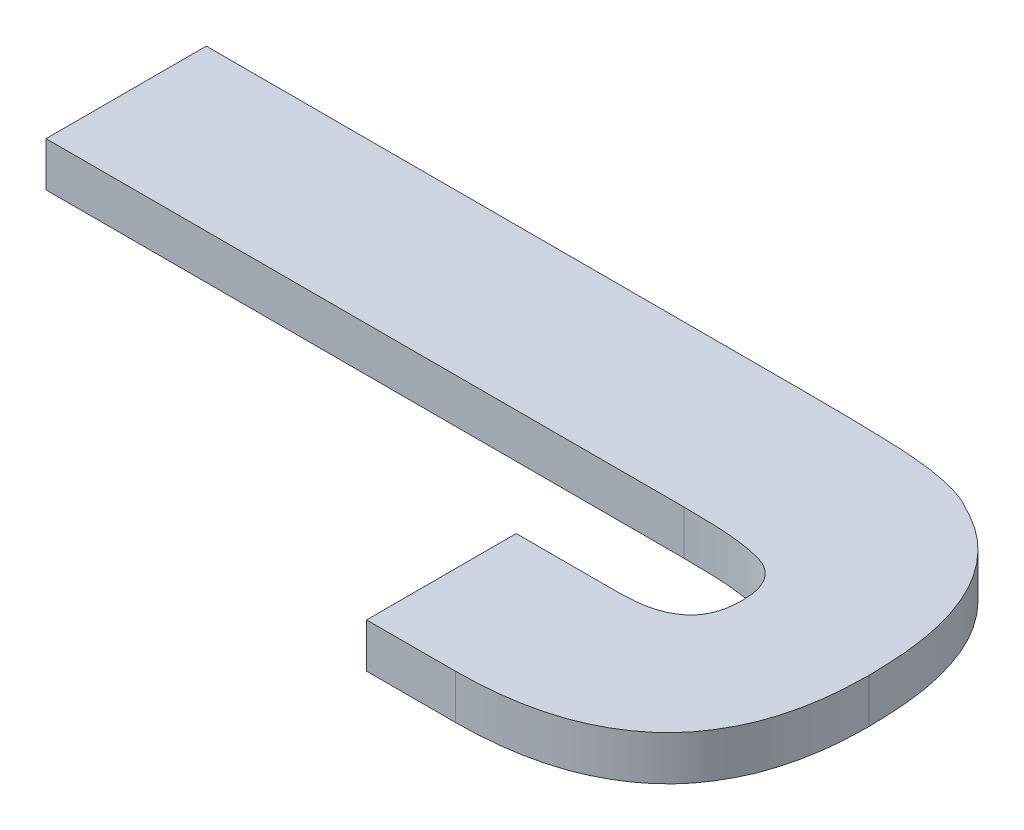
ISO-10303-21;
HEADER;
FILE_DESCRIPTION(('STEP AP214'),'2;1');
FILE_NAME('part.step','',(''),(''),'','','');
FILE_SCHEMA(('AUTOMOTIVE_DESIGN { 1 0 10303 214 1 1 1 1 }'));
ENDSEC;
DATA;
#1=APPLICATION_CONTEXT('core data for automotive mechanical design processes');
#2=APPLICATION_PROTOCOL_DEFINITION('international standard','automotive_design',2000,#1);
#3=PRODUCT_CONTEXT('',#1,'mechanical');
#4=PRODUCT('Part','Part','',(#3));
#5=PRODUCT_RELATED_PRODUCT_CATEGORY('part','',(#4));
#6=PRODUCT_DEFINITION_FORMATION('','',#4);
#7=PRODUCT_DEFINITION_CONTEXT('part definition',#1,'design');
#8=PRODUCT_DEFINITION('design','',#6,#7);
#9=PRODUCT_DEFINITION_SHAPE('','',#8);
#10=(LENGTH_UNIT() NAMED_UNIT(*) SI_UNIT(.MILLI.,.METRE.));
#11=(NAMED_UNIT(*) PLANE_ANGLE_UNIT() SI_UNIT($,.RADIAN.));
#12=(NAMED_UNIT(*) SI_UNIT($,.STERADIAN.) SOLID_ANGLE_UNIT());
#13=UNCERTAINTY_MEASURE_WITH_UNIT(LENGTH_MEASURE(1.E-05),#10,'distance_accuracy_value','');
#14=(GEOMETRIC_REPRESENTATION_CONTEXT(3) GLOBAL_UNCERTAINTY_ASSIGNED_CONTEXT((#13)) GLOBAL_UNIT_ASSIGNED_CONTEXT((#10,
#11,#12)) REPRESENTATION_CONTEXT('',''));
#15=CARTESIAN_POINT('',(0.,0.,0.));
#16=DIRECTION('',(0.,0.,1.));
#17=DIRECTION('',(1.,0.,0.));
#18=AXIS2_PLACEMENT_3D('',#15,#16,#17);
#19=CARTESIAN_POINT('',(2.0840978836,2.9906,4.3741557850555));
#20=DIRECTION('',(0.,0.,1.));
#21=DIRECTION('',(0.,-1.,0.));
#22=AXIS2_PLACEMENT_3D('',#19,#20,#21);
#23=PLANE('',#22);
#24=DIRECTION('',(-1.,0.,0.));
#25=VECTOR('',#24,1.);
#26=CARTESIAN_POINT('',(2.0840978836,2.9306,4.3741557850555));
#27=LINE('',#26,#25);
#28=CARTESIAN_POINT('',(2.0840978836,2.9306,4.3741557850555));
#29=VERTEX_POINT('',#28);
#30=CARTESIAN_POINT('',(1.9642541336,2.9306,4.3741557850555));
#31=VERTEX_POINT('',#30);
#32=EDGE_CURVE('E11',#29,#31,#27,.T.);
#33=ORIENTED_EDGE('',*,*,#32,.F.);
#34=DIRECTION('',(0.,-1.,0.));
#35=VECTOR('',#34,1.);
#36=CARTESIAN_POINT('',(2.0840978836,2.9906,4.3741557850555));
#37=LINE('',#36,#35);
#38=CARTESIAN_POINT('',(2.0840978836,2.9906,4.3741557850555));
#39=VERTEX_POINT('',#38);
#40=EDGE_CURVE('E24',#39,#29,#37,.T.);
#41=ORIENTED_EDGE('',*,*,#40,.F.);
#42=DIRECTION('',(-1.,0.,0.));
#43=VECTOR('',#42,1.);
#44=CARTESIAN_POINT('',(2.0840978836,2.9906,4.3741557850555));
#45=LINE('',#44,#43);
#46=CARTESIAN_POINT('',(1.9642541336,2.9906,4.3741557850555));
#47=VERTEX_POINT('',#46);
#48=EDGE_CURVE('E244',#39,#47,#45,.T.);
#49=ORIENTED_EDGE('',*,*,#48,.T.);
#50=DIRECTION('',(0.,-1.,0.));
#51=VECTOR('',#50,1.);
#52=CARTESIAN_POINT('',(1.9642541336,2.9906,4.3741557850555));
#53=LINE('',#52,#51);
#54=EDGE_CURVE('E120',#47,#31,#53,.T.);
#55=ORIENTED_EDGE('',*,*,#54,.T.);
#56=EDGE_LOOP('',(#33,#41,#49,#55));
#57=FACE_BOUND('',#56,.T.);
#58=ADVANCED_FACE('F17',(#57),#23,.T.);
#59=CARTESIAN_POINT('',(2.3686985780444,2.9906,4.099711340611));
#60=CARTESIAN_POINT('',(2.3686985780444,2.9306,4.099711340611));
#61=CARTESIAN_POINT('',(2.3684961906251,2.9906,4.1107792519947));
#62=CARTESIAN_POINT('',(2.3684961906251,2.9306,4.1107792519947));
#63=CARTESIAN_POINT('',(2.3681041661007,2.9906,4.1322178014375));
#64=CARTESIAN_POINT('',(2.3681041661007,2.9306,4.1322178014375));
#65=CARTESIAN_POINT('',(2.3646813892459,2.9906,4.1633243721228));
#66=CARTESIAN_POINT('',(2.3646813892459,2.9306,4.1633243721228));
#67=CARTESIAN_POINT('',(2.3590525967969,2.9906,4.1922251989204));
#68=CARTESIAN_POINT('',(2.3590525967969,2.9306,4.1922251989204));
#69=CARTESIAN_POINT('',(2.3514966605484,2.9906,4.2191540828439));
#70=CARTESIAN_POINT('',(2.3514966605484,2.9306,4.2191540828439));
#71=CARTESIAN_POINT('',(2.3412777970055,2.9906,4.2438895573409));
#72=CARTESIAN_POINT('',(2.3412777970055,2.9306,4.2438895573409));
#73=CARTESIAN_POINT('',(2.3287792206801,2.9906,4.2665361280315));
#74=CARTESIAN_POINT('',(2.3287792206801,2.9306,4.2665361280315));
#75=CARTESIAN_POINT('',(2.3143745762558,2.9906,4.2873711796985));
#76=CARTESIAN_POINT('',(2.3143745762558,2.9306,4.2873711796985));
#77=CARTESIAN_POINT('',(2.2972805098538,2.9906,4.3056514824483));
#78=CARTESIAN_POINT('',(2.2972805098538,2.9306,4.3056514824483));
#79=CARTESIAN_POINT('',(2.2781177542668,2.9906,4.3218700809515));
#80=CARTESIAN_POINT('',(2.2781177542668,2.9306,4.3218700809515));
#81=CARTESIAN_POINT('',(2.2567230719195,2.9906,4.3359046646467));
#82=CARTESIAN_POINT('',(2.2567230719195,2.9306,4.3359046646467));
#83=CARTESIAN_POINT('',(2.2331909255557,2.9906,4.3478704630677));
#84=CARTESIAN_POINT('',(2.2331909255557,2.9306,4.3478704630677));
#85=CARTESIAN_POINT('',(2.2075281212777,2.9906,4.3575799157711));
#86=CARTESIAN_POINT('',(2.2075281212777,2.9306,4.3575799157711));
#87=CARTESIAN_POINT('',(2.179686874294,2.9906,4.364993925283));
#88=CARTESIAN_POINT('',(2.179686874294,2.9306,4.364993925283));
#89=CARTESIAN_POINT('',(2.1497226885865,2.9906,4.370360844908));
#90=CARTESIAN_POINT('',(2.1497226885865,2.9306,4.370360844908));
#91=CARTESIAN_POINT('',(2.1175669153872,2.9906,4.3734906674268));
#92=CARTESIAN_POINT('',(2.1175669153872,2.9306,4.3734906674268));
#93=CARTESIAN_POINT('',(2.0954647450341,2.9906,4.3739298956431));
#94=CARTESIAN_POINT('',(2.0954647450341,2.9306,4.3739298956431));
#95=CARTESIAN_POINT('',(2.0840978836,2.9906,4.3741557850555));
#96=CARTESIAN_POINT('',(2.0840978836,2.9306,4.3741557850555));
#97=B_SPLINE_SURFACE_WITH_KNOTS('',3,1,((#59,#60),(#61,#62),(#63,#64),(#65,#66),(#67,#68),(#69,
#70),(#71,#72),(#73,#74),(#75,#76),(#77,#78),(#79,#80),(#81,#82),(#83,#84),(#85,#86),(#87,#88),
(#89,#90),(#91,#92),(#93,#94),(#95,#96)),.UNSPECIFIED.,.F.,.F.,.F.,(4,1,1,1,1,1,1,1,1,1,1,1,1,1,
1,1,4),(2,2),(0.,0.0732734976880392,0.141930798735896,0.206901551831919,0.268077284735017,
0.326823463536979,0.38367829497039,0.439100806924737,0.494094020293022,0.548886045195723,
0.604982851534821,0.663132456099408,0.723363791074527,0.786324811204568,0.853651669388618,
0.924734939211817,1.),(0.,1.),.UNSPECIFIED.);
#98=CARTESIAN_POINT('',(2.3686985780444,2.9306,4.099711340611));
#99=CARTESIAN_POINT('',(2.3684961906251,2.9306,4.1107792519947));
#100=CARTESIAN_POINT('',(2.3681041661007,2.9306,4.1322178014375));
#101=CARTESIAN_POINT('',(2.3646813892459,2.9306,4.1633243721228));
#102=CARTESIAN_POINT('',(2.3590525967969,2.9306,4.1922251989204));
#103=CARTESIAN_POINT('',(2.3514966605484,2.9306,4.2191540828439));
#104=CARTESIAN_POINT('',(2.3412777970055,2.9306,4.2438895573409));
#105=CARTESIAN_POINT('',(2.3287792206801,2.9306,4.2665361280315));
#106=CARTESIAN_POINT('',(2.3143745762558,2.9306,4.2873711796985));
#107=CARTESIAN_POINT('',(2.2972805098538,2.9306,4.3056514824483));
#108=CARTESIAN_POINT('',(2.2781177542668,2.9306,4.3218700809515));
#109=CARTESIAN_POINT('',(2.2567230719195,2.9306,4.3359046646467));
#110=CARTESIAN_POINT('',(2.2331909255557,2.9306,4.3478704630677));
#111=CARTESIAN_POINT('',(2.2075281212777,2.9306,4.3575799157711));
#112=CARTESIAN_POINT('',(2.179686874294,2.9306,4.364993925283));
#113=CARTESIAN_POINT('',(2.1497226885865,2.9306,4.370360844908));
#114=CARTESIAN_POINT('',(2.1175669153872,2.9306,4.3734906674268));
#115=CARTESIAN_POINT('',(2.0954647450341,2.9306,4.3739298956431));
#116=CARTESIAN_POINT('',(2.0840978836,2.9306,4.3741557850555));
#117=B_SPLINE_CURVE_WITH_KNOTS('',3,(#98,#99,#100,#101,#102,#103,#104,#105,#106,#107,#108,#109,
#110,#111,#112,#113,#114,#115,#116),.UNSPECIFIED.,.F.,.F.,(4,1,1,1,1,1,1,1,1,1,1,1,1,1,1,1,4),
(0.,0.0732734976880392,0.141930798735896,0.206901551831919,0.268077284735017,0.326823463536979,
0.38367829497039,0.439100806924737,0.494094020293022,0.548886045195723,0.604982851534821,
0.663132456099408,0.723363791074527,0.786324811204568,0.853651669388618,0.924734939211817,1.),.UNSPECIFIED.);
#118=CARTESIAN_POINT('',(2.3686985780444,2.9306,4.099711340611));
#119=VERTEX_POINT('',#118);
#120=EDGE_CURVE('E236',#119,#29,#117,.T.);
#121=DIRECTION('',(0.,-1.,0.));
#122=VECTOR('',#121,1.);
#123=CARTESIAN_POINT('',(2.3686985780444,2.9906,4.099711340611));
#124=LINE('',#123,#122);
#125=CARTESIAN_POINT('',(2.3686985780444,2.9906,4.099711340611));
#126=VERTEX_POINT('',#125);
#127=EDGE_CURVE('E230',#126,#119,#124,.T.);
#128=CARTESIAN_POINT('',(2.3686985780444,2.9906,4.099711340611));
#129=CARTESIAN_POINT('',(2.3684961906251,2.9906,4.1107792519947));
#130=CARTESIAN_POINT('',(2.3681041661007,2.9906,4.1322178014375));
#131=CARTESIAN_POINT('',(2.3646813892459,2.9906,4.1633243721228));
#132=CARTESIAN_POINT('',(2.3590525967969,2.9906,4.1922251989204));
#133=CARTESIAN_POINT('',(2.3514966605484,2.9906,4.2191540828439));
#134=CARTESIAN_POINT('',(2.3412777970055,2.9906,4.2438895573409));
#135=CARTESIAN_POINT('',(2.3287792206801,2.9906,4.2665361280315));
#136=CARTESIAN_POINT('',(2.3143745762558,2.9906,4.2873711796985));
#137=CARTESIAN_POINT('',(2.2972805098538,2.9906,4.3056514824483));
#138=CARTESIAN_POINT('',(2.2781177542668,2.9906,4.3218700809515));
#139=CARTESIAN_POINT('',(2.2567230719195,2.9906,4.3359046646467));
#140=CARTESIAN_POINT('',(2.2331909255557,2.9906,4.3478704630677));
#141=CARTESIAN_POINT('',(2.2075281212777,2.9906,4.3575799157711));
#142=CARTESIAN_POINT('',(2.179686874294,2.9906,4.364993925283));
#143=CARTESIAN_POINT('',(2.1497226885865,2.9906,4.370360844908));
#144=CARTESIAN_POINT('',(2.1175669153872,2.9906,4.3734906674268));
#145=CARTESIAN_POINT('',(2.0954647450341,2.9906,4.3739298956431));
#146=CARTESIAN_POINT('',(2.0840978836,2.9906,4.3741557850555));
#147=B_SPLINE_CURVE_WITH_KNOTS('',3,(#128,#129,#130,#131,#132,#133,#134,#135,#136,#137,#138,
#139,#140,#141,#142,#143,#144,#145,#146),.UNSPECIFIED.,.F.,.F.,(4,1,1,1,1,1,1,1,1,1,1,1,1,1,1,1,
4),(0.,0.0732734976880392,0.141930798735896,0.206901551831919,0.268077284735017,
0.326823463536979,0.38367829497039,0.439100806924737,0.494094020293022,0.548886045195723,
0.604982851534821,0.663132456099408,0.723363791074527,0.786324811204568,0.853651669388618,
0.924734939211817,1.),.UNSPECIFIED.);
#148=EDGE_CURVE('E222',#126,#39,#147,.T.);
#149=ORIENTED_EDGE('',*,*,#120,.F.);
#150=ORIENTED_EDGE('',*,*,#127,.F.);
#151=ORIENTED_EDGE('',*,*,#148,.T.);
#152=ORIENTED_EDGE('',*,*,#40,.T.);
#153=EDGE_LOOP('',(#149,#150,#151,#152));
#154=FACE_BOUND('',#153,.T.);
#155=ADVANCED_FACE('F246',(#154),#97,.T.);
#156=CARTESIAN_POINT('',(2.2280909391555,2.9906,3.8329405072777));
#157=CARTESIAN_POINT('',(2.2280909391555,2.9306,3.8329405072777));
#158=CARTESIAN_POINT('',(2.2393451820832,2.9906,3.8387810913324));
#159=CARTESIAN_POINT('',(2.2393451820832,2.9306,3.8387810913324));
#160=CARTESIAN_POINT('',(2.2614186535248,2.9906,3.8502365011866));
#161=CARTESIAN_POINT('',(2.2614186535248,2.9306,3.8502365011866));
#162=CARTESIAN_POINT('',(2.29084693265,2.9906,3.8728717678507));
#163=CARTESIAN_POINT('',(2.29084693265,2.9306,3.8728717678507));
#164=CARTESIAN_POINT('',(2.3151261852842,2.9906,3.900161132454));
#165=CARTESIAN_POINT('',(2.3151261852842,2.9306,3.900161132454));
#166=CARTESIAN_POINT('',(2.3351498875105,2.9906,3.9313419982357));
#167=CARTESIAN_POINT('',(2.3351498875105,2.9306,3.9313419982357));
#168=CARTESIAN_POINT('',(2.3502125356949,2.9906,3.9670374247872));
#169=CARTESIAN_POINT('',(2.3502125356949,2.9306,3.9670374247872));
#170=CARTESIAN_POINT('',(2.3613325365982,2.9906,4.007048245364));
#171=CARTESIAN_POINT('',(2.3613325365982,2.9306,4.007048245364));
#172=CARTESIAN_POINT('',(2.3674033447803,2.9906,4.0519059229754));
#173=CARTESIAN_POINT('',(2.3674033447803,2.9306,4.0519059229754));
#174=CARTESIAN_POINT('',(2.3682537547865,2.9906,4.0832934781228));
#175=CARTESIAN_POINT('',(2.3682537547865,2.9306,4.0832934781228));
#176=CARTESIAN_POINT('',(2.3686985780444,2.9906,4.099711340611));
#177=CARTESIAN_POINT('',(2.3686985780444,2.9306,4.099711340611));
#178=B_SPLINE_SURFACE_WITH_KNOTS('',3,1,((#156,#157),(#158,#159),(#160,#161),(#162,#163),(#164,
#165),(#166,#167),(#168,#169),(#170,#171),(#172,#173),(#174,#175),(#176,#177)),.UNSPECIFIED.,
.F.,.F.,.F.,(4,1,1,1,1,1,1,1,4),(2,2),(0.,0.118506089621052,0.23243151953542,0.345099154038738,
0.458763236799667,0.577647250652674,0.706270073409169,0.846358930448891,1.),(0.,1.),.UNSPECIFIED.);
#179=CARTESIAN_POINT('',(2.2280909391555,2.9306,3.8329405072777));
#180=CARTESIAN_POINT('',(2.2393451820832,2.9306,3.8387810913324));
#181=CARTESIAN_POINT('',(2.2614186535248,2.9306,3.8502365011866));
#182=CARTESIAN_POINT('',(2.29084693265,2.9306,3.8728717678507));
#183=CARTESIAN_POINT('',(2.3151261852842,2.9306,3.900161132454));
#184=CARTESIAN_POINT('',(2.3351498875105,2.9306,3.9313419982357));
#185=CARTESIAN_POINT('',(2.3502125356949,2.9306,3.9670374247872));
#186=CARTESIAN_POINT('',(2.3613325365982,2.9306,4.007048245364));
#187=CARTESIAN_POINT('',(2.3674033447803,2.9306,4.0519059229754));
#188=CARTESIAN_POINT('',(2.3682537547865,2.9306,4.0832934781228));
#189=CARTESIAN_POINT('',(2.3686985780444,2.9306,4.099711340611));
#190=B_SPLINE_CURVE_WITH_KNOTS('',3,(#179,#180,#181,#182,#183,#184,#185,#186,#187,#188,#189),
.UNSPECIFIED.,.F.,.F.,(4,1,1,1,1,1,1,1,4),(0.,0.118506089621052,0.23243151953542,
0.345099154038738,0.458763236799667,0.577647250652674,0.706270073409169,0.846358930448891,1.),.UNSPECIFIED.);
#191=CARTESIAN_POINT('',(2.2280909391555,2.9306,3.8329405072777));
#192=VERTEX_POINT('',#191);
#193=EDGE_CURVE('E217',#192,#119,#190,.T.);
#194=DIRECTION('',(0.,-1.,0.));
#195=VECTOR('',#194,1.);
#196=CARTESIAN_POINT('',(2.2280909391555,2.9906,3.8329405072777));
#197=LINE('',#196,#195);
#198=CARTESIAN_POINT('',(2.2280909391555,2.9906,3.8329405072777));
#199=VERTEX_POINT('',#198);
#200=EDGE_CURVE('E211',#199,#192,#197,.T.);
#201=CARTESIAN_POINT('',(2.2280909391555,2.9906,3.8329405072777));
#202=CARTESIAN_POINT('',(2.2393451820832,2.9906,3.8387810913324));
#203=CARTESIAN_POINT('',(2.2614186535248,2.9906,3.8502365011866));
#204=CARTESIAN_POINT('',(2.29084693265,2.9906,3.8728717678507));
#205=CARTESIAN_POINT('',(2.3151261852842,2.9906,3.900161132454));
#206=CARTESIAN_POINT('',(2.3351498875105,2.9906,3.9313419982357));
#207=CARTESIAN_POINT('',(2.3502125356949,2.9906,3.9670374247872));
#208=CARTESIAN_POINT('',(2.3613325365982,2.9906,4.007048245364));
#209=CARTESIAN_POINT('',(2.3674033447803,2.9906,4.0519059229754));
#210=CARTESIAN_POINT('',(2.3682537547865,2.9906,4.0832934781228));
#211=CARTESIAN_POINT('',(2.3686985780444,2.9906,4.099711340611));
#212=B_SPLINE_CURVE_WITH_KNOTS('',3,(#201,#202,#203,#204,#205,#206,#207,#208,#209,#210,#211),
.UNSPECIFIED.,.F.,.F.,(4,1,1,1,1,1,1,1,4),(0.,0.118506089621052,0.23243151953542,
0.345099154038738,0.458763236799667,0.577647250652674,0.706270073409169,0.846358930448891,1.),.UNSPECIFIED.);
#213=EDGE_CURVE('E203',#199,#126,#212,.T.);
#214=ORIENTED_EDGE('',*,*,#193,.F.);
#215=ORIENTED_EDGE('',*,*,#200,.F.);
#216=ORIENTED_EDGE('',*,*,#213,.T.);
#217=ORIENTED_EDGE('',*,*,#127,.T.);
#218=EDGE_LOOP('',(#214,#215,#216,#217));
#219=FACE_BOUND('',#218,.T.);
#220=ADVANCED_FACE('F250',(#219),#178,.T.);
#221=CARTESIAN_POINT('',(1.9870492724888,2.9906,3.8108224517221));
#222=CARTESIAN_POINT('',(1.9870492724888,2.9306,3.8108224517221));
#223=CARTESIAN_POINT('',(1.9969797662226,2.9906,3.8108084640767));
#224=CARTESIAN_POINT('',(1.9969797662226,2.9306,3.8108084640767));
#225=CARTESIAN_POINT('',(2.0160135234123,2.9906,3.8107816539852));
#226=CARTESIAN_POINT('',(2.0160135234123,2.9306,3.8107816539852));
#227=CARTESIAN_POINT('',(2.0434002587895,2.9906,3.8109648857174));
#228=CARTESIAN_POINT('',(2.0434002587895,2.9306,3.8109648857174));
#229=CARTESIAN_POINT('',(2.0682974904155,2.9906,3.8115419172009));
#230=CARTESIAN_POINT('',(2.0682974904155,2.9306,3.8115419172009));
#231=CARTESIAN_POINT('',(2.0907306444029,2.9906,3.8117400000978));
#232=CARTESIAN_POINT('',(2.0907306444029,2.9306,3.8117400000978));
#233=CARTESIAN_POINT('',(2.1105719712284,2.9906,3.812942222705));
#234=CARTESIAN_POINT('',(2.1105719712284,2.9306,3.812942222705));
#235=CARTESIAN_POINT('',(2.1279784865962,2.9906,3.8133120176138));
#236=CARTESIAN_POINT('',(2.1279784865962,2.9306,3.8133120176138));
#237=CARTESIAN_POINT('',(2.1428598537432,2.9906,3.8145935420674));
#238=CARTESIAN_POINT('',(2.1428598537432,2.9306,3.8145935420674));
#239=CARTESIAN_POINT('',(2.1591493593028,2.9906,3.8159661137574));
#240=CARTESIAN_POINT('',(2.1591493593028,2.9306,3.8159661137574));
#241=CARTESIAN_POINT('',(2.1768187142603,2.9906,3.8183822004314));
#242=CARTESIAN_POINT('',(2.1768187142603,2.9306,3.8183822004314));
#243=CARTESIAN_POINT('',(2.1959579322411,2.9906,3.8222372183264));
#244=CARTESIAN_POINT('',(2.1959579322411,2.9306,3.8222372183264));
#245=CARTESIAN_POINT('',(2.2129488335749,2.9906,3.8267681632253));
#246=CARTESIAN_POINT('',(2.2129488335749,2.9306,3.8267681632253));
#247=CARTESIAN_POINT('',(2.2232351426045,2.9906,3.8309611493343));
#248=CARTESIAN_POINT('',(2.2232351426045,2.9306,3.8309611493343));
#249=CARTESIAN_POINT('',(2.2280909391555,2.9906,3.8329405072777));
#250=CARTESIAN_POINT('',(2.2280909391555,2.9306,3.8329405072777));
#251=B_SPLINE_SURFACE_WITH_KNOTS('',3,1,((#221,#222),(#223,#224),(#225,#226),(#227,#228),(#229,
#230),(#231,#232),(#233,#234),(#235,#236),(#237,#238),(#239,#240),(#241,#242),(#243,#244),(#245,
#246),(#247,#248),(#249,#250)),.UNSPECIFIED.,.F.,.F.,.F.,(4,1,1,1,1,1,1,1,1,1,1,1,4),(2,2),(0.,
0.12236698312663,0.234540548265863,0.337456758558624,0.429250721722469,0.510912941769872,
0.582347838028555,0.643706650862371,0.694903147272131,0.783791032011835,0.863239627088275,
0.935440346466085,1.),(0.,1.),.UNSPECIFIED.);
#252=CARTESIAN_POINT('',(1.9870492724888,2.9306,3.8108224517221));
#253=CARTESIAN_POINT('',(1.9969797662226,2.9306,3.8108084640767));
#254=CARTESIAN_POINT('',(2.0160135234123,2.9306,3.8107816539852));
#255=CARTESIAN_POINT('',(2.0434002587895,2.9306,3.8109648857174));
#256=CARTESIAN_POINT('',(2.0682974904155,2.9306,3.8115419172009));
#257=CARTESIAN_POINT('',(2.0907306444029,2.9306,3.8117400000978));
#258=CARTESIAN_POINT('',(2.1105719712284,2.9306,3.812942222705));
#259=CARTESIAN_POINT('',(2.1279784865962,2.9306,3.8133120176138));
#260=CARTESIAN_POINT('',(2.1428598537432,2.9306,3.8145935420674));
#261=CARTESIAN_POINT('',(2.1591493593028,2.9306,3.8159661137574));
#262=CARTESIAN_POINT('',(2.1768187142603,2.9306,3.8183822004314));
#263=CARTESIAN_POINT('',(2.1959579322411,2.9306,3.8222372183264));
#264=CARTESIAN_POINT('',(2.2129488335749,2.9306,3.8267681632253));
#265=CARTESIAN_POINT('',(2.2232351426045,2.9306,3.8309611493343));
#266=CARTESIAN_POINT('',(2.2280909391555,2.9306,3.8329405072777));
#267=B_SPLINE_CURVE_WITH_KNOTS('',3,(#252,#253,#254,#255,#256,#257,#258,#259,#260,#261,#262,
#263,#264,#265,#266),.UNSPECIFIED.,.F.,.F.,(4,1,1,1,1,1,1,1,1,1,1,1,4),(0.,0.12236698312663,
0.234540548265863,0.337456758558624,0.429250721722469,0.510912941769872,0.582347838028555,
0.643706650862371,0.694903147272131,0.783791032011835,0.863239627088275,0.935440346466085,1.),.UNSPECIFIED.);
#268=CARTESIAN_POINT('',(1.9870492724888,2.9306,3.8108224517221));
#269=VERTEX_POINT('',#268);
#270=EDGE_CURVE('E198',#269,#192,#267,.T.);
#271=DIRECTION('',(0.,-1.,0.));
#272=VECTOR('',#271,1.);
#273=CARTESIAN_POINT('',(1.9870492724888,2.9906,3.8108224517221));
#274=LINE('',#273,#272);
#275=CARTESIAN_POINT('',(1.9870492724888,2.9906,3.8108224517221));
#276=VERTEX_POINT('',#275);
#277=EDGE_CURVE('E192',#276,#269,#274,.T.);
#278=CARTESIAN_POINT('',(1.9870492724888,2.9906,3.8108224517221));
#279=CARTESIAN_POINT('',(1.9969797662226,2.9906,3.8108084640767));
#280=CARTESIAN_POINT('',(2.0160135234123,2.9906,3.8107816539852));
#281=CARTESIAN_POINT('',(2.0434002587895,2.9906,3.8109648857174));
#282=CARTESIAN_POINT('',(2.0682974904155,2.9906,3.8115419172009));
#283=CARTESIAN_POINT('',(2.0907306444029,2.9906,3.8117400000978));
#284=CARTESIAN_POINT('',(2.1105719712284,2.9906,3.812942222705));
#285=CARTESIAN_POINT('',(2.1279784865962,2.9906,3.8133120176138));
#286=CARTESIAN_POINT('',(2.1428598537432,2.9906,3.8145935420674));
#287=CARTESIAN_POINT('',(2.1591493593028,2.9906,3.8159661137574));
#288=CARTESIAN_POINT('',(2.1768187142603,2.9906,3.8183822004314));
#289=CARTESIAN_POINT('',(2.1959579322411,2.9906,3.8222372183264));
#290=CARTESIAN_POINT('',(2.2129488335749,2.9906,3.8267681632253));
#291=CARTESIAN_POINT('',(2.2232351426045,2.9906,3.8309611493343));
#292=CARTESIAN_POINT('',(2.2280909391555,2.9906,3.8329405072777));
#293=B_SPLINE_CURVE_WITH_KNOTS('',3,(#278,#279,#280,#281,#282,#283,#284,#285,#286,#287,#288,
#289,#290,#291,#292),.UNSPECIFIED.,.F.,.F.,(4,1,1,1,1,1,1,1,1,1,1,1,4),(0.,0.12236698312663,
0.234540548265863,0.337456758558624,0.429250721722469,0.510912941769872,0.582347838028555,
0.643706650862371,0.694903147272131,0.783791032011835,0.863239627088275,0.935440346466085,1.),.UNSPECIFIED.);
#294=EDGE_CURVE('E187',#276,#199,#293,.T.);
#295=ORIENTED_EDGE('',*,*,#270,.F.);
#296=ORIENTED_EDGE('',*,*,#277,.F.);
#297=ORIENTED_EDGE('',*,*,#294,.T.);
#298=ORIENTED_EDGE('',*,*,#200,.T.);
#299=EDGE_LOOP('',(#295,#296,#297,#298));
#300=FACE_BOUND('',#299,.T.);
#301=ADVANCED_FACE('F253',(#300),#251,.T.);
#302=CARTESIAN_POINT('',(1.1842541336,2.9906,3.8108224517221));
#303=DIRECTION('',(0.,0.,-1.));
#304=DIRECTION('',(0.,1.,0.));
#305=AXIS2_PLACEMENT_3D('',#302,#303,#304);
#306=PLANE('',#305);
#307=DIRECTION('',(1.,0.,0.));
#308=VECTOR('',#307,1.);
#309=CARTESIAN_POINT('',(1.1842541336,2.9306,3.8108224517221));
#310=LINE('',#309,#308);
#311=CARTESIAN_POINT('',(1.1842541336,2.9306,3.8108224517221));
#312=VERTEX_POINT('',#311);
#313=EDGE_CURVE('E184',#312,#269,#310,.T.);
#314=ORIENTED_EDGE('',*,*,#313,.F.);
#315=DIRECTION('',(0.,-1.,0.));
#316=VECTOR('',#315,1.);
#317=CARTESIAN_POINT('',(1.1842541336,2.9906,3.8108224517221));
#318=LINE('',#317,#316);
#319=CARTESIAN_POINT('',(1.1842541336,2.9906,3.8108224517221));
#320=VERTEX_POINT('',#319);
#321=EDGE_CURVE('E181',#320,#312,#318,.T.);
#322=ORIENTED_EDGE('',*,*,#321,.F.);
#323=DIRECTION('',(1.,0.,0.));
#324=VECTOR('',#323,1.);
#325=CARTESIAN_POINT('',(1.1842541336,2.9906,3.8108224517221));
#326=LINE('',#325,#324);
#327=EDGE_CURVE('E178',#320,#276,#326,.T.);
#328=ORIENTED_EDGE('',*,*,#327,.T.);
#329=ORIENTED_EDGE('',*,*,#277,.T.);
#330=EDGE_LOOP('',(#314,#322,#328,#329));
#331=FACE_BOUND('',#330,.T.);
#332=ADVANCED_FACE('F258',(#331),#306,.T.);
#333=CARTESIAN_POINT('',(1.1842541336,2.9906,4.0274891183888));
#334=DIRECTION('',(-1.,0.,0.));
#335=DIRECTION('',(0.,1.,0.));
#336=AXIS2_PLACEMENT_3D('',#333,#334,#335);
#337=PLANE('',#336);
#338=DIRECTION('',(0.,0.,-1.));
#339=VECTOR('',#338,1.);
#340=CARTESIAN_POINT('',(1.1842541336,2.9306,4.0274891183888));
#341=LINE('',#340,#339);
#342=CARTESIAN_POINT('',(1.1842541336,2.9306,4.0274891183888));
#343=VERTEX_POINT('',#342);
#344=EDGE_CURVE('E175',#343,#312,#341,.T.);
#345=ORIENTED_EDGE('',*,*,#344,.F.);
#346=DIRECTION('',(0.,-1.,0.));
#347=VECTOR('',#346,1.);
#348=CARTESIAN_POINT('',(1.1842541336,2.9906,4.0274891183888));
#349=LINE('',#348,#347);
#350=CARTESIAN_POINT('',(1.1842541336,2.9906,4.0274891183888));
#351=VERTEX_POINT('',#350);
#352=EDGE_CURVE('E172',#351,#343,#349,.T.);
#353=ORIENTED_EDGE('',*,*,#352,.F.);
#354=DIRECTION('',(0.,0.,-1.));
#355=VECTOR('',#354,1.);
#356=CARTESIAN_POINT('',(1.1842541336,2.9906,4.0274891183888));
#357=LINE('',#356,#355);
#358=EDGE_CURVE('E169',#351,#320,#357,.T.);
#359=ORIENTED_EDGE('',*,*,#358,.T.);
#360=ORIENTED_EDGE('',*,*,#321,.T.);
#361=EDGE_LOOP('',(#345,#353,#359,#360));
#362=FACE_BOUND('',#361,.T.);
#363=ADVANCED_FACE('F260',(#362),#337,.T.);
#364=CARTESIAN_POINT('',(1.9947228836,2.9906,4.0274891183888));
#365=DIRECTION('',(0.,0.,1.));
#366=DIRECTION('',(0.,-1.,0.));
#367=AXIS2_PLACEMENT_3D('',#364,#365,#366);
#368=PLANE('',#367);
#369=DIRECTION('',(-1.,0.,0.));
#370=VECTOR('',#369,1.);
#371=CARTESIAN_POINT('',(1.9947228836,2.9306,4.0274891183888));
#372=LINE('',#371,#370);
#373=CARTESIAN_POINT('',(2.0466326058222,2.9306,4.0274891183888));
#374=VERTEX_POINT('',#373);
#375=EDGE_CURVE('E166',#374,#343,#372,.T.);
#376=ORIENTED_EDGE('',*,*,#375,.F.);
#377=DIRECTION('',(0.,-1.,0.));
#378=VECTOR('',#377,1.);
#379=CARTESIAN_POINT('',(2.0466326058222,2.9906,4.0274891183888));
#380=LINE('',#379,#378);
#381=CARTESIAN_POINT('',(2.0466326058222,2.9906,4.0274891183888));
#382=VERTEX_POINT('',#381);
#383=EDGE_CURVE('E163',#382,#374,#380,.T.);
#384=ORIENTED_EDGE('',*,*,#383,.F.);
#385=DIRECTION('',(-1.,0.,0.));
#386=VECTOR('',#385,1.);
#387=CARTESIAN_POINT('',(2.0466326058222,2.9906,4.0274891183888));
#388=LINE('',#387,#386);
#389=EDGE_CURVE('E157',#382,#351,#388,.T.);
#390=ORIENTED_EDGE('',*,*,#389,.T.);
#391=ORIENTED_EDGE('',*,*,#352,.T.);
#392=EDGE_LOOP('',(#376,#384,#390,#391));
#393=FACE_BOUND('',#392,.T.);
#394=ADVANCED_FACE('F262',(#393),#368,.T.);
#395=CARTESIAN_POINT('',(2.1953652447111,2.9906,4.0981314794999));
#396=CARTESIAN_POINT('',(2.1953652447111,2.9306,4.0981314794999));
#397=CARTESIAN_POINT('',(2.1951431998691,2.9906,4.0918451487251));
#398=CARTESIAN_POINT('',(2.1951431998691,2.9306,4.0918451487251));
#399=CARTESIAN_POINT('',(2.1947306313364,2.9906,4.080164885224));
#400=CARTESIAN_POINT('',(2.1947306313364,2.9306,4.080164885224));
#401=CARTESIAN_POINT('',(2.1896357900808,2.9906,4.0641049026942));
#402=CARTESIAN_POINT('',(2.1896357900808,2.9306,4.0641049026942));
#403=CARTESIAN_POINT('',(2.181163265791,2.9906,4.051153610988));
#404=CARTESIAN_POINT('',(2.181163265791,2.9306,4.051153610988));
#405=CARTESIAN_POINT('',(2.1709261650026,2.9906,4.0432829425851));
#406=CARTESIAN_POINT('',(2.1709261650026,2.9306,4.0432829425851));
#407=CARTESIAN_POINT('',(2.1608580461792,2.9906,4.0385587154984));
#408=CARTESIAN_POINT('',(2.1608580461792,2.9306,4.0385587154984));
#409=CARTESIAN_POINT('',(2.1508376156634,2.9906,4.0357918112487));
#410=CARTESIAN_POINT('',(2.1508376156634,2.9306,4.0357918112487));
#411=CARTESIAN_POINT('',(2.1388896946128,2.9906,4.033047404268));
#412=CARTESIAN_POINT('',(2.1388896946128,2.9306,4.033047404268));
#413=CARTESIAN_POINT('',(2.1245955268725,2.9906,4.0311967292564));
#414=CARTESIAN_POINT('',(2.1245955268725,2.9306,4.0311967292564));
#415=CARTESIAN_POINT('',(2.1082885560346,2.9906,4.0292749518306));
#416=CARTESIAN_POINT('',(2.1082885560346,2.9306,4.0292749518306));
#417=CARTESIAN_POINT('',(2.0896741812996,2.9906,4.0282993518106));
#418=CARTESIAN_POINT('',(2.0896741812996,2.9306,4.0282993518106));
#419=CARTESIAN_POINT('',(2.0689070310441,2.9906,4.0275930170901));
#420=CARTESIAN_POINT('',(2.0689070310441,2.9306,4.0275930170901));
#421=CARTESIAN_POINT('',(2.0543070991903,2.9906,4.0275249159408));
#422=CARTESIAN_POINT('',(2.0543070991903,2.9306,4.0275249159408));
#423=CARTESIAN_POINT('',(2.0466326058222,2.9906,4.0274891183888));
#424=CARTESIAN_POINT('',(2.0466326058222,2.9306,4.0274891183888));
#425=B_SPLINE_SURFACE_WITH_KNOTS('',3,1,((#395,#396),(#397,#398),(#399,#400),(#401,#402),(#403,
#404),(#405,#406),(#407,#408),(#409,#410),(#411,#412),(#413,#414),(#415,#416),(#417,#418),(#419,
#420),(#421,#422),(#423,#424)),.UNSPECIFIED.,.F.,.F.,.F.,(4,1,1,1,1,1,1,1,1,1,1,1,4),(2,2),(0.,
0.0996375845084952,0.185130767590113,0.264423990265739,0.341956239560129,0.386905586992331,
0.440641746407963,0.506812602891359,0.58175470542933,0.669600556124424,0.767871642421325,
0.877981105759936,1.),(0.,1.),.UNSPECIFIED.);
#426=CARTESIAN_POINT('',(2.1953652447111,2.9306,4.0981314794999));
#427=CARTESIAN_POINT('',(2.1951431998691,2.9306,4.0918451487251));
#428=CARTESIAN_POINT('',(2.1947306313364,2.9306,4.080164885224));
#429=CARTESIAN_POINT('',(2.1896357900808,2.9306,4.0641049026942));
#430=CARTESIAN_POINT('',(2.181163265791,2.9306,4.051153610988));
#431=CARTESIAN_POINT('',(2.1709261650026,2.9306,4.0432829425851));
#432=CARTESIAN_POINT('',(2.1608580461792,2.9306,4.0385587154984));
#433=CARTESIAN_POINT('',(2.1508376156634,2.9306,4.0357918112487));
#434=CARTESIAN_POINT('',(2.1388896946128,2.9306,4.033047404268));
#435=CARTESIAN_POINT('',(2.1245955268725,2.9306,4.0311967292564));
#436=CARTESIAN_POINT('',(2.1082885560346,2.9306,4.0292749518306));
#437=CARTESIAN_POINT('',(2.0896741812996,2.9306,4.0282993518106));
#438=CARTESIAN_POINT('',(2.0689070310441,2.9306,4.0275930170901));
#439=CARTESIAN_POINT('',(2.0543070991903,2.9306,4.0275249159408));
#440=CARTESIAN_POINT('',(2.0466326058222,2.9306,4.0274891183888));
#441=B_SPLINE_CURVE_WITH_KNOTS('',3,(#426,#427,#428,#429,#430,#431,#432,#433,#434,#435,#436,
#437,#438,#439,#440),.UNSPECIFIED.,.F.,.F.,(4,1,1,1,1,1,1,1,1,1,1,1,4),(0.,0.0996375845084952,
0.185130767590113,0.264423990265739,0.341956239560129,0.386905586992331,0.440641746407963,
0.506812602891359,0.58175470542933,0.669600556124424,0.767871642421325,0.877981105759936,1.),.UNSPECIFIED.);
#442=CARTESIAN_POINT('',(2.1953652447111,2.9306,4.0981314794999));
#443=VERTEX_POINT('',#442);
#444=EDGE_CURVE('E152',#443,#374,#441,.T.);
#445=DIRECTION('',(0.,-1.,0.));
#446=VECTOR('',#445,1.);
#447=CARTESIAN_POINT('',(2.1953652447111,2.9906,4.0981314794999));
#448=LINE('',#447,#446);
#449=CARTESIAN_POINT('',(2.1953652447111,2.9906,4.0981314794999));
#450=VERTEX_POINT('',#449);
#451=EDGE_CURVE('E146',#450,#443,#448,.T.);
#452=CARTESIAN_POINT('',(2.1953652447111,2.9906,4.0981314794999));
#453=CARTESIAN_POINT('',(2.1951431998691,2.9906,4.0918451487251));
#454=CARTESIAN_POINT('',(2.1947306313364,2.9906,4.080164885224));
#455=CARTESIAN_POINT('',(2.1896357900808,2.9906,4.0641049026942));
#456=CARTESIAN_POINT('',(2.181163265791,2.9906,4.051153610988));
#457=CARTESIAN_POINT('',(2.1709261650026,2.9906,4.0432829425851));
#458=CARTESIAN_POINT('',(2.1608580461792,2.9906,4.0385587154984));
#459=CARTESIAN_POINT('',(2.1508376156634,2.9906,4.0357918112487));
#460=CARTESIAN_POINT('',(2.1388896946128,2.9906,4.033047404268));
#461=CARTESIAN_POINT('',(2.1245955268725,2.9906,4.0311967292564));
#462=CARTESIAN_POINT('',(2.1082885560346,2.9906,4.0292749518306));
#463=CARTESIAN_POINT('',(2.0896741812996,2.9906,4.0282993518106));
#464=CARTESIAN_POINT('',(2.0689070310441,2.9906,4.0275930170901));
#465=CARTESIAN_POINT('',(2.0543070991903,2.9906,4.0275249159408));
#466=CARTESIAN_POINT('',(2.0466326058222,2.9906,4.0274891183888));
#467=B_SPLINE_CURVE_WITH_KNOTS('',3,(#452,#453,#454,#455,#456,#457,#458,#459,#460,#461,#462,
#463,#464,#465,#466),.UNSPECIFIED.,.F.,.F.,(4,1,1,1,1,1,1,1,1,1,1,1,4),(0.,0.0996375845084952,
0.185130767590113,0.264423990265739,0.341956239560129,0.386905586992331,0.440641746407963,
0.506812602891359,0.58175470542933,0.669600556124424,0.767871642421325,0.877981105759936,1.),.UNSPECIFIED.);
#468=EDGE_CURVE('E138',#450,#382,#467,.T.);
#469=ORIENTED_EDGE('',*,*,#444,.F.);
#470=ORIENTED_EDGE('',*,*,#451,.F.);
#471=ORIENTED_EDGE('',*,*,#468,.T.);
#472=ORIENTED_EDGE('',*,*,#383,.T.);
#473=EDGE_LOOP('',(#469,#470,#471,#472));
#474=FACE_BOUND('',#473,.T.);
#475=ADVANCED_FACE('F265',(#474),#425,.T.);
#476=CARTESIAN_POINT('',(2.1030562169333,2.9906,4.1719335628332));
#477=CARTESIAN_POINT('',(2.1030562169333,2.9306,4.1719335628332));
#478=CARTESIAN_POINT('',(2.1102928843307,2.9906,4.1717416156486));
#479=CARTESIAN_POINT('',(2.1102928843307,2.9306,4.1717416156486));
#480=CARTESIAN_POINT('',(2.1239530948362,2.9906,4.1713792887924));
#481=CARTESIAN_POINT('',(2.1239530948362,2.9306,4.1713792887924));
#482=CARTESIAN_POINT('',(2.1429912238828,2.9906,4.1680928176021));
#483=CARTESIAN_POINT('',(2.1429912238828,2.9306,4.1680928176021));
#484=CARTESIAN_POINT('',(2.1592139905842,2.9906,4.1625400433578));
#485=CARTESIAN_POINT('',(2.1592139905842,2.9306,4.1625400433578));
#486=CARTESIAN_POINT('',(2.1724850360211,2.9906,4.1544802715809));
#487=CARTESIAN_POINT('',(2.1724850360211,2.9306,4.1544802715809));
#488=CARTESIAN_POINT('',(2.1831691276581,2.9906,4.1440614466965));
#489=CARTESIAN_POINT('',(2.1831691276581,2.9306,4.1440614466965));
#490=CARTESIAN_POINT('',(2.1903700912128,2.9906,4.1307649387356));
#491=CARTESIAN_POINT('',(2.1903700912128,2.9306,4.1307649387356));
#492=CARTESIAN_POINT('',(2.1947831542761,2.9906,4.1151858860117));
#493=CARTESIAN_POINT('',(2.1947831542761,2.9306,4.1151858860117));
#494=CARTESIAN_POINT('',(2.1951638443545,2.9906,4.1040322181934));
#495=CARTESIAN_POINT('',(2.1951638443545,2.9306,4.1040322181934));
#496=CARTESIAN_POINT('',(2.1953652447111,2.9906,4.0981314794999));
#497=CARTESIAN_POINT('',(2.1953652447111,2.9306,4.0981314794999));
#498=B_SPLINE_SURFACE_WITH_KNOTS('',3,1,((#476,#477),(#478,#479),(#480,#481),(#482,#483),(#484,
#485),(#486,#487),(#488,#489),(#490,#491),(#492,#493),(#494,#495),(#496,#497)),.UNSPECIFIED.,
.F.,.F.,.F.,(4,1,1,1,1,1,1,1,4),(2,2),(0.,0.160335147657556,0.302654764706389,0.426630128722181,
0.538192372623191,0.644336693461614,0.753364103973698,0.86951969535213,1.),(0.,1.),.UNSPECIFIED.);
#499=CARTESIAN_POINT('',(2.1030562169333,2.9306,4.1719335628332));
#500=CARTESIAN_POINT('',(2.1102928843307,2.9306,4.1717416156486));
#501=CARTESIAN_POINT('',(2.1239530948362,2.9306,4.1713792887924));
#502=CARTESIAN_POINT('',(2.1429912238828,2.9306,4.1680928176021));
#503=CARTESIAN_POINT('',(2.1592139905842,2.9306,4.1625400433578));
#504=CARTESIAN_POINT('',(2.1724850360211,2.9306,4.1544802715809));
#505=CARTESIAN_POINT('',(2.1831691276581,2.9306,4.1440614466965));
#506=CARTESIAN_POINT('',(2.1903700912128,2.9306,4.1307649387356));
#507=CARTESIAN_POINT('',(2.1947831542761,2.9306,4.1151858860117));
#508=CARTESIAN_POINT('',(2.1951638443545,2.9306,4.1040322181934));
#509=CARTESIAN_POINT('',(2.1953652447111,2.9306,4.0981314794999));
#510=B_SPLINE_CURVE_WITH_KNOTS('',3,(#499,#500,#501,#502,#503,#504,#505,#506,#507,#508,#509),
.UNSPECIFIED.,.F.,.F.,(4,1,1,1,1,1,1,1,4),(0.,0.160335147657556,0.302654764706389,
0.426630128722181,0.538192372623191,0.644336693461614,0.753364103973698,0.86951969535213,1.),.UNSPECIFIED.);
#511=CARTESIAN_POINT('',(2.1030562169333,2.9306,4.1719335628332));
#512=VERTEX_POINT('',#511);
#513=EDGE_CURVE('E133',#512,#443,#510,.T.);
#514=DIRECTION('',(0.,-1.,0.));
#515=VECTOR('',#514,1.);
#516=CARTESIAN_POINT('',(2.1030562169333,2.9906,4.1719335628332));
#517=LINE('',#516,#515);
#518=CARTESIAN_POINT('',(2.1030562169333,2.9906,4.1719335628332));
#519=VERTEX_POINT('',#518);
#520=EDGE_CURVE('E128',#519,#512,#517,.T.);
#521=CARTESIAN_POINT('',(2.1030562169333,2.9906,4.1719335628332));
#522=CARTESIAN_POINT('',(2.1102928843307,2.9906,4.1717416156486));
#523=CARTESIAN_POINT('',(2.1239530948362,2.9906,4.1713792887924));
#524=CARTESIAN_POINT('',(2.1429912238828,2.9906,4.1680928176021));
#525=CARTESIAN_POINT('',(2.1592139905842,2.9906,4.1625400433578));
#526=CARTESIAN_POINT('',(2.1724850360211,2.9906,4.1544802715809));
#527=CARTESIAN_POINT('',(2.1831691276581,2.9906,4.1440614466965));
#528=CARTESIAN_POINT('',(2.1903700912128,2.9906,4.1307649387356));
#529=CARTESIAN_POINT('',(2.1947831542761,2.9906,4.1151858860117));
#530=CARTESIAN_POINT('',(2.1951638443545,2.9906,4.1040322181934));
#531=CARTESIAN_POINT('',(2.1953652447111,2.9906,4.0981314794999));
#532=B_SPLINE_CURVE_WITH_KNOTS('',3,(#521,#522,#523,#524,#525,#526,#527,#528,#529,#530,#531),
.UNSPECIFIED.,.F.,.F.,(4,1,1,1,1,1,1,1,4),(0.,0.160335147657556,0.302654764706389,
0.426630128722181,0.538192372623191,0.644336693461614,0.753364103973698,0.86951969535213,1.),.UNSPECIFIED.);
#533=EDGE_CURVE('E115',#519,#450,#532,.T.);
#534=ORIENTED_EDGE('',*,*,#513,.F.);
#535=ORIENTED_EDGE('',*,*,#520,.F.);
#536=ORIENTED_EDGE('',*,*,#533,.T.);
#537=ORIENTED_EDGE('',*,*,#451,.T.);
#538=EDGE_LOOP('',(#534,#535,#536,#537));
#539=FACE_BOUND('',#538,.T.);
#540=ADVANCED_FACE('F267',(#539),#498,.T.);
#541=CARTESIAN_POINT('',(1.9642541336,2.9906,4.1719335628332));
#542=DIRECTION('',(0.,0.,-1.));
#543=DIRECTION('',(0.,1.,0.));
#544=AXIS2_PLACEMENT_3D('',#541,#542,#543);
#545=PLANE('',#544);
#546=DIRECTION('',(1.,0.,0.));
#547=VECTOR('',#546,1.);
#548=CARTESIAN_POINT('',(1.9642541336,2.9306,4.1719335628332));
#549=LINE('',#548,#547);
#550=CARTESIAN_POINT('',(1.9642541336,2.9306,4.1719335628332));
#551=VERTEX_POINT('',#550);
#552=EDGE_CURVE('E102',#551,#512,#549,.T.);
#553=ORIENTED_EDGE('',*,*,#552,.F.);
#554=DIRECTION('',(0.,-1.,0.));
#555=VECTOR('',#554,1.);
#556=CARTESIAN_POINT('',(1.9642541336,2.9906,4.1719335628332));
#557=LINE('',#556,#555);
#558=CARTESIAN_POINT('',(1.9642541336,2.9906,4.1719335628332));
#559=VERTEX_POINT('',#558);
#560=EDGE_CURVE('E96',#559,#551,#557,.T.);
#561=ORIENTED_EDGE('',*,*,#560,.F.);
#562=DIRECTION('',(1.,0.,0.));
#563=VECTOR('',#562,1.);
#564=CARTESIAN_POINT('',(1.9642541336,2.9906,4.1719335628332));
#565=LINE('',#564,#563);
#566=EDGE_CURVE('E100',#559,#519,#565,.T.);
#567=ORIENTED_EDGE('',*,*,#566,.T.);
#568=ORIENTED_EDGE('',*,*,#520,.T.);
#569=EDGE_LOOP('',(#553,#561,#567,#568));
#570=FACE_BOUND('',#569,.T.);
#571=ADVANCED_FACE('F98',(#570),#545,.T.);
#572=CARTESIAN_POINT('',(1.9642541336,2.9906,4.3741557850555));
#573=DIRECTION('',(-1.,0.,0.));
#574=DIRECTION('',(0.,1.,0.));
#575=AXIS2_PLACEMENT_3D('',#572,#573,#574);
#576=PLANE('',#575);
#577=DIRECTION('',(0.,0.,-1.));
#578=VECTOR('',#577,1.);
#579=CARTESIAN_POINT('',(1.9642541336,2.9306,4.3741557850555));
#580=LINE('',#579,#578);
#581=EDGE_CURVE('E116',#31,#551,#580,.T.);
#582=ORIENTED_EDGE('',*,*,#581,.F.);
#583=ORIENTED_EDGE('',*,*,#54,.F.);
#584=DIRECTION('',(0.,0.,-1.));
#585=VECTOR('',#584,1.);
#586=CARTESIAN_POINT('',(1.9642541336,2.9906,4.3741557850555));
#587=LINE('',#586,#585);
#588=EDGE_CURVE('E112',#47,#559,#587,.T.);
#589=ORIENTED_EDGE('',*,*,#588,.T.);
#590=ORIENTED_EDGE('',*,*,#560,.T.);
#591=EDGE_LOOP('',(#582,#583,#589,#590));
#592=FACE_BOUND('',#591,.T.);
#593=ADVANCED_FACE('F119',(#592),#576,.T.);
#594=CARTESIAN_POINT('',(2.1681367191464,2.9906,4.1569013618208));
#595=DIRECTION('',(1.69635649177176E-13,-1.,1.87661792398141E-12));
#596=DIRECTION('',(0.,-1.87661792398141E-12,-1.));
#597=AXIS2_PLACEMENT_3D('',#594,#595,#596);
#598=PLANE('',#597);
#599=ORIENTED_EDGE('',*,*,#48,.F.);
#600=ORIENTED_EDGE('',*,*,#148,.F.);
#601=ORIENTED_EDGE('',*,*,#213,.F.);
#602=ORIENTED_EDGE('',*,*,#294,.F.);
#603=ORIENTED_EDGE('',*,*,#327,.F.);
#604=ORIENTED_EDGE('',*,*,#358,.F.);
#605=ORIENTED_EDGE('',*,*,#389,.F.);
#606=ORIENTED_EDGE('',*,*,#468,.F.);
#607=ORIENTED_EDGE('',*,*,#533,.F.);
#608=ORIENTED_EDGE('',*,*,#566,.F.);
#609=ORIENTED_EDGE('',*,*,#588,.F.);
#610=EDGE_LOOP('',(#599,#600,#601,#602,#603,#604,#605,#606,#607,#608,#609));
#611=FACE_BOUND('',#610,.T.);
#612=ADVANCED_FACE('F111',(#611),#598,.F.);
#613=CARTESIAN_POINT('',(2.1681367191464,2.9306,4.1569013618208));
#614=DIRECTION('',(1.69635649177176E-13,-1.,1.87661792398141E-12));
#615=DIRECTION('',(0.,-1.87661792398141E-12,-1.));
#616=AXIS2_PLACEMENT_3D('',#613,#614,#615);
#617=PLANE('',#616);
#618=ORIENTED_EDGE('',*,*,#32,.T.);
#619=ORIENTED_EDGE('',*,*,#581,.T.);
#620=ORIENTED_EDGE('',*,*,#552,.T.);
#621=ORIENTED_EDGE('',*,*,#513,.T.);
#622=ORIENTED_EDGE('',*,*,#444,.T.);
#623=ORIENTED_EDGE('',*,*,#375,.T.);
#624=ORIENTED_EDGE('',*,*,#344,.T.);
#625=ORIENTED_EDGE('',*,*,#313,.T.);
#626=ORIENTED_EDGE('',*,*,#270,.T.);
#627=ORIENTED_EDGE('',*,*,#193,.T.);
#628=ORIENTED_EDGE('',*,*,#120,.T.);
#629=EDGE_LOOP('',(#618,#619,#620,#621,#622,#623,#624,#625,#626,#627,#628));
#630=FACE_BOUND('',#629,.T.);
#631=ADVANCED_FACE('F248',(#630),#617,.T.);
#632=CLOSED_SHELL('',(#58,#155,#220,#301,#332,#363,#394,#475,#540,#571,#593,#612,#631));
#633=MANIFOLD_SOLID_BREP('B1',#632);
#634=ADVANCED_BREP_SHAPE_REPRESENTATION('',(#18,#633),#14);
#635=SHAPE_DEFINITION_REPRESENTATION(#9,#634);
ENDSEC;
END-ISO-10303-21;
